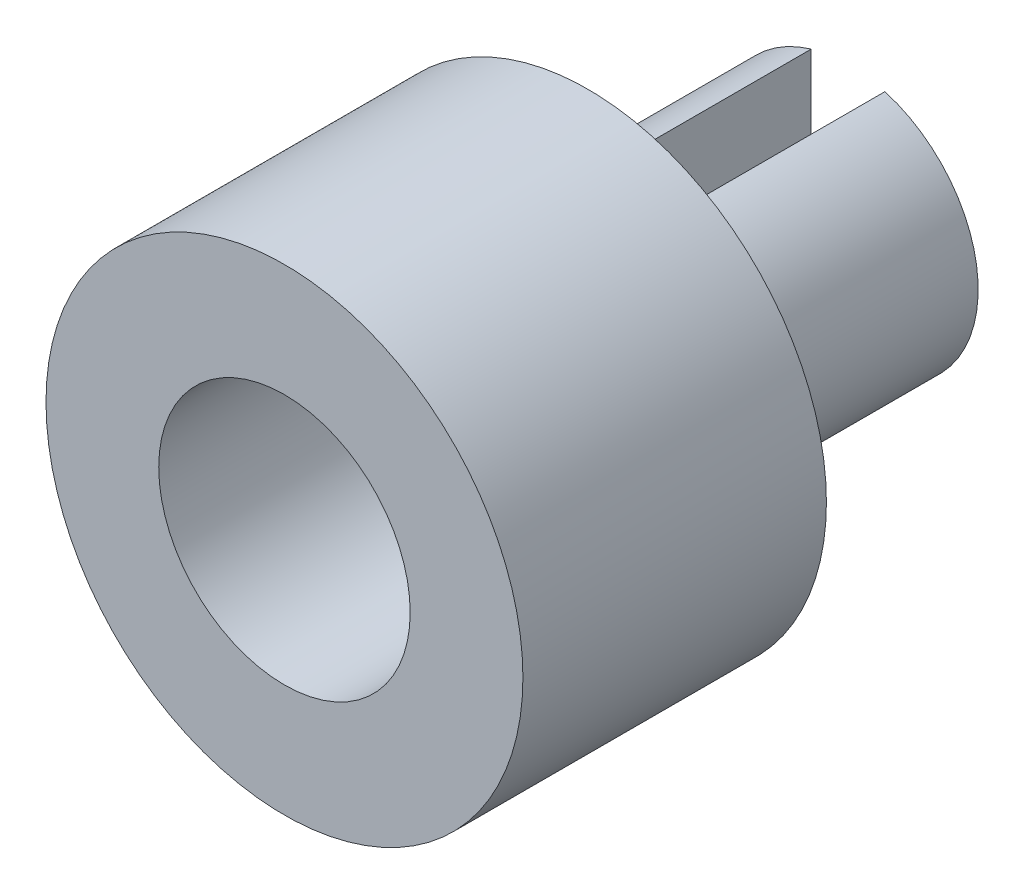
ISO-10303-21;
HEADER;
FILE_DESCRIPTION(('STEP AP214'),'2;1');
FILE_NAME('part.step','',(''),(''),'','','');
FILE_SCHEMA(('AUTOMOTIVE_DESIGN { 1 0 10303 214 1 1 1 1 }'));
ENDSEC;
DATA;
#1=APPLICATION_CONTEXT('core data for automotive mechanical design processes');
#2=APPLICATION_PROTOCOL_DEFINITION('international standard','automotive_design',2000,#1);
#3=PRODUCT_CONTEXT('',#1,'mechanical');
#4=PRODUCT('Part','Part','',(#3));
#5=PRODUCT_RELATED_PRODUCT_CATEGORY('part','',(#4));
#6=PRODUCT_DEFINITION_FORMATION('','',#4);
#7=PRODUCT_DEFINITION_CONTEXT('part definition',#1,'design');
#8=PRODUCT_DEFINITION('design','',#6,#7);
#9=PRODUCT_DEFINITION_SHAPE('','',#8);
#10=(LENGTH_UNIT() NAMED_UNIT(*) SI_UNIT(.MILLI.,.METRE.));
#11=(NAMED_UNIT(*) PLANE_ANGLE_UNIT() SI_UNIT($,.RADIAN.));
#12=(NAMED_UNIT(*) SI_UNIT($,.STERADIAN.) SOLID_ANGLE_UNIT());
#13=UNCERTAINTY_MEASURE_WITH_UNIT(LENGTH_MEASURE(1.E-05),#10,'distance_accuracy_value','');
#14=(GEOMETRIC_REPRESENTATION_CONTEXT(3) GLOBAL_UNCERTAINTY_ASSIGNED_CONTEXT((#13)) GLOBAL_UNIT_ASSIGNED_CONTEXT((#10,
#11,#12)) REPRESENTATION_CONTEXT('',''));
#15=CARTESIAN_POINT('',(0.,0.,0.));
#16=DIRECTION('',(0.,0.,1.));
#17=DIRECTION('',(1.,0.,0.));
#18=AXIS2_PLACEMENT_3D('',#15,#16,#17);
#19=CARTESIAN_POINT('',(10.,0.,2.));
#20=DIRECTION('',(0.,0.,1.));
#21=DIRECTION('',(1.,0.,0.));
#22=AXIS2_PLACEMENT_3D('',#19,#20,#21);
#23=CYLINDRICAL_SURFACE('',#22,5.5);
#24=CARTESIAN_POINT('',(10.,0.,2.));
#25=DIRECTION('',(0.,0.,-1.));
#26=DIRECTION('',(-1.,0.,0.));
#27=AXIS2_PLACEMENT_3D('',#24,#25,#26);
#28=CIRCLE('',#27,5.5);
#29=CARTESIAN_POINT('',(4.5,0.,2.));
#30=VERTEX_POINT('',#29);
#31=EDGE_CURVE('E163',#30,#30,#28,.T.);
#32=ORIENTED_EDGE('',*,*,#31,.F.);
#33=EDGE_LOOP('',(#32));
#34=FACE_BOUND('',#33,.T.);
#35=CARTESIAN_POINT('',(10.,0.,9.));
#36=DIRECTION('',(0.,0.,-1.));
#37=DIRECTION('',(-1.,0.,0.));
#38=AXIS2_PLACEMENT_3D('',#35,#36,#37);
#39=CIRCLE('',#38,5.5);
#40=CARTESIAN_POINT('',(4.5,0.,9.));
#41=VERTEX_POINT('',#40);
#42=EDGE_CURVE('E162',#41,#41,#39,.T.);
#43=ORIENTED_EDGE('',*,*,#42,.T.);
#44=EDGE_LOOP('',(#43));
#45=FACE_BOUND('',#44,.T.);
#46=ADVANCED_FACE('F57',(#34,#45),#23,.T.);
#47=CARTESIAN_POINT('',(10.,0.,2.));
#48=DIRECTION('',(0.,0.,-1.));
#49=DIRECTION('',(-1.,0.,0.));
#50=AXIS2_PLACEMENT_3D('',#47,#48,#49);
#51=PLANE('',#50);
#52=CARTESIAN_POINT('',(10.,0.,2.));
#53=DIRECTION('',(0.,0.,-1.));
#54=DIRECTION('',(-1.,0.,0.));
#55=AXIS2_PLACEMENT_3D('',#52,#53,#54);
#56=CIRCLE('',#55,3.2);
#57=CARTESIAN_POINT('',(10.05,-3.19960935115523,2.));
#58=VERTEX_POINT('',#57);
#59=CARTESIAN_POINT('',(10.05,3.19960935115523,2.));
#60=VERTEX_POINT('',#59);
#61=EDGE_CURVE('E175',#58,#60,#56,.F.);
#62=ORIENTED_EDGE('',*,*,#61,.T.);
#63=DIRECTION('',(0.,1.,0.));
#64=VECTOR('',#63,1.);
#65=CARTESIAN_POINT('',(10.05,0.,2.));
#66=LINE('',#65,#64);
#67=EDGE_CURVE('E185',#60,#58,#66,.F.);
#68=ORIENTED_EDGE('',*,*,#67,.T.);
#69=EDGE_LOOP('',(#62,#68));
#70=FACE_BOUND('',#69,.T.);
#71=CARTESIAN_POINT('',(10.,0.,2.));
#72=DIRECTION('',(0.,0.,-1.));
#73=DIRECTION('',(-1.,0.,0.));
#74=AXIS2_PLACEMENT_3D('',#71,#72,#73);
#75=CIRCLE('',#74,3.2);
#76=CARTESIAN_POINT('',(9.95,3.19960935115523,2.));
#77=VERTEX_POINT('',#76);
#78=CARTESIAN_POINT('',(9.95,-3.19960935115523,2.));
#79=VERTEX_POINT('',#78);
#80=EDGE_CURVE('E172',#77,#79,#75,.F.);
#81=ORIENTED_EDGE('',*,*,#80,.T.);
#82=DIRECTION('',(0.,-1.,0.));
#83=VECTOR('',#82,1.);
#84=CARTESIAN_POINT('',(9.95,0.,2.));
#85=LINE('',#84,#83);
#86=EDGE_CURVE('E189',#79,#77,#85,.F.);
#87=ORIENTED_EDGE('',*,*,#86,.T.);
#88=EDGE_LOOP('',(#81,#87));
#89=FACE_BOUND('',#88,.T.);
#90=ORIENTED_EDGE('',*,*,#31,.T.);
#91=EDGE_LOOP('',(#90));
#92=FACE_BOUND('',#91,.T.);
#93=ADVANCED_FACE('F271',(#70,#89,#92),#51,.T.);
#94=CARTESIAN_POINT('',(10.,0.,9.));
#95=DIRECTION('',(0.,0.,-1.));
#96=DIRECTION('',(-1.,0.,0.));
#97=AXIS2_PLACEMENT_3D('',#94,#95,#96);
#98=PLANE('',#97);
#99=CARTESIAN_POINT('',(10.,0.,9.));
#100=DIRECTION('',(0.,0.,1.));
#101=DIRECTION('',(1.,0.,0.));
#102=AXIS2_PLACEMENT_3D('',#99,#100,#101);
#103=CIRCLE('',#102,2.9);
#104=CARTESIAN_POINT('',(12.9,0.,9.));
#105=VERTEX_POINT('',#104);
#106=EDGE_CURVE('E323',#105,#105,#103,.T.);
#107=ORIENTED_EDGE('',*,*,#106,.F.);
#108=EDGE_LOOP('',(#107));
#109=FACE_BOUND('',#108,.T.);
#110=ORIENTED_EDGE('',*,*,#42,.F.);
#111=EDGE_LOOP('',(#110));
#112=FACE_BOUND('',#111,.T.);
#113=ADVANCED_FACE('F277',(#109,#112),#98,.F.);
#114=CARTESIAN_POINT('',(9.15,0.,-4.));
#115=DIRECTION('',(-1.,0.,0.));
#116=DIRECTION('',(0.,0.,1.));
#117=AXIS2_PLACEMENT_3D('',#114,#115,#116);
#118=PLANE('',#117);
#119=DIRECTION('',(0.,0.,1.));
#120=VECTOR('',#119,1.);
#121=CARTESIAN_POINT('',(9.15,2.87706447616316,-4.));
#122=LINE('',#121,#120);
#123=CARTESIAN_POINT('',(9.15,2.87706447616316,-4.));
#124=VERTEX_POINT('',#123);
#125=CARTESIAN_POINT('',(9.15,2.87706447616316,1.2));
#126=VERTEX_POINT('',#125);
#127=EDGE_CURVE('E154',#124,#126,#122,.T.);
#128=ORIENTED_EDGE('',*,*,#127,.T.);
#129=DIRECTION('',(0.,-1.,0.));
#130=VECTOR('',#129,1.);
#131=CARTESIAN_POINT('',(9.15,0.,1.2));
#132=LINE('',#131,#130);
#133=CARTESIAN_POINT('',(9.15,-2.87706447616316,1.2));
#134=VERTEX_POINT('',#133);
#135=EDGE_CURVE('E181',#126,#134,#132,.T.);
#136=ORIENTED_EDGE('',*,*,#135,.T.);
#137=DIRECTION('',(0.,0.,1.));
#138=VECTOR('',#137,1.);
#139=CARTESIAN_POINT('',(9.15,-2.87706447616316,-4.));
#140=LINE('',#139,#138);
#141=CARTESIAN_POINT('',(9.15,-2.87706447616316,-4.));
#142=VERTEX_POINT('',#141);
#143=EDGE_CURVE('E158',#142,#134,#140,.T.);
#144=ORIENTED_EDGE('',*,*,#143,.F.);
#145=DIRECTION('',(0.,-1.,0.));
#146=VECTOR('',#145,1.);
#147=CARTESIAN_POINT('',(9.15,0.,-4.));
#148=LINE('',#147,#146);
#149=EDGE_CURVE('E146',#124,#142,#148,.T.);
#150=ORIENTED_EDGE('',*,*,#149,.F.);
#151=EDGE_LOOP('',(#128,#136,#144,#150));
#152=FACE_BOUND('',#151,.T.);
#153=ADVANCED_FACE('F269',(#152),#118,.F.);
#154=CARTESIAN_POINT('',(10.,0.,-4.));
#155=DIRECTION('',(0.,0.,1.));
#156=DIRECTION('',(1.,0.,0.));
#157=AXIS2_PLACEMENT_3D('',#154,#155,#156);
#158=CYLINDRICAL_SURFACE('',#157,3.);
#159=ORIENTED_EDGE('',*,*,#143,.T.);
#160=CARTESIAN_POINT('',(9.15,-2.87706447616316,1.2));
#161=CARTESIAN_POINT('',(9.14995658457261,-2.87702294042068,1.24401457858481));
#162=CARTESIAN_POINT('',(9.1536290746142,-2.87813650607465,1.28799891287807));
#163=CARTESIAN_POINT('',(9.1680679009095,-2.88235815882223,1.37460277954558));
#164=CARTESIAN_POINT('',(9.17881993904506,-2.88546222549705,1.41722488158952));
#165=CARTESIAN_POINT('',(9.20708174329589,-2.89335137437877,1.49998521487485));
#166=CARTESIAN_POINT('',(9.22459121849557,-2.89813638421831,1.54012355295887));
#167=CARTESIAN_POINT('',(9.26582480006136,-2.90885562563724,1.61689230002051));
#168=CARTESIAN_POINT('',(9.28954653958198,-2.91478941931102,1.65352403775475));
#169=CARTESIAN_POINT('',(9.3316802306274,-2.92465486296381,1.70827234108567));
#170=CARTESIAN_POINT('',(9.34829380464681,-2.92841239747392,1.72783228721421));
#171=CARTESIAN_POINT('',(9.38328199921848,-2.93598015903384,1.76522988002132));
#172=CARTESIAN_POINT('',(9.40165341614599,-2.93979027979277,1.7830705452375));
#173=CARTESIAN_POINT('',(9.42084973778708,-2.94356670958528,1.8));
#174=B_SPLINE_CURVE_WITH_KNOTS('',3,(#160,#161,#162,#163,#164,#165,#166,#167,#168,#169,#170,
#171,#172,#173),.UNSPECIFIED.,.F.,.F.,(4,2,2,2,2,2,4),(0.,0.131830819997787,0.263396202907975,
0.394955922406245,0.526465590965929,0.604170225827502,0.681735849640497),.UNSPECIFIED.);
#175=CARTESIAN_POINT('',(9.42084973778708,-2.94356670958528,1.8));
#176=VERTEX_POINT('',#175);
#177=EDGE_CURVE('E196',#134,#176,#174,.T.);
#178=ORIENTED_EDGE('',*,*,#177,.T.);
#179=CARTESIAN_POINT('',(10.,0.,1.8));
#180=DIRECTION('',(0.,0.,-1.));
#181=DIRECTION('',(-1.,0.,0.));
#182=AXIS2_PLACEMENT_3D('',#179,#180,#181);
#183=CIRCLE('',#182,3.);
#184=CARTESIAN_POINT('',(9.42084973778708,2.94356670958528,1.8));
#185=VERTEX_POINT('',#184);
#186=EDGE_CURVE('E178',#176,#185,#183,.T.);
#187=ORIENTED_EDGE('',*,*,#186,.T.);
#188=CARTESIAN_POINT('',(9.42084973778708,2.94356670958528,1.8));
#189=CARTESIAN_POINT('',(9.38716589528042,2.93693942544863,1.77033263749932));
#190=CARTESIAN_POINT('',(9.35602623353235,2.93021071354206,1.73779647140253));
#191=CARTESIAN_POINT('',(9.29953026339045,2.91722219970662,1.66786765293636));
#192=CARTESIAN_POINT('',(9.27418360078941,2.91096319134023,1.63046706103298));
#193=CARTESIAN_POINT('',(9.23005322310111,2.89960412420635,1.5517382645471));
#194=CARTESIAN_POINT('',(9.21127899347871,2.89450574415884,1.51040449196748));
#195=CARTESIAN_POINT('',(9.1809818080549,2.88608026899819,1.42506029743404));
#196=CARTESIAN_POINT('',(9.16944272075491,2.88274923597299,1.38105607172221));
#197=CARTESIAN_POINT('',(9.15781644895303,2.87936476540232,1.31388140835428));
#198=CARTESIAN_POINT('',(9.15488792021617,2.87850513526242,1.29120921315739));
#199=CARTESIAN_POINT('',(9.15097998138233,2.87735417811352,1.24569532796752));
#200=CARTESIAN_POINT('',(9.14999954165248,2.87706255089679,1.22285373391912));
#201=CARTESIAN_POINT('',(9.15,2.87706447616316,1.2));
#202=B_SPLINE_CURVE_WITH_KNOTS('',3,(#188,#189,#190,#191,#192,#193,#194,#195,#196,#197,#198,
#199,#200,#201),.UNSPECIFIED.,.F.,.F.,(4,2,2,2,2,2,4),(0.,0.13596976450787,0.272164306056535,
0.4085546036824,0.54463971346313,0.6131904999176,0.681705045246736),.UNSPECIFIED.);
#203=EDGE_CURVE('E234',#185,#126,#202,.T.);
#204=ORIENTED_EDGE('',*,*,#203,.T.);
#205=ORIENTED_EDGE('',*,*,#127,.F.);
#206=CARTESIAN_POINT('',(10.,0.,-4.));
#207=DIRECTION('',(0.,0.,-1.));
#208=DIRECTION('',(-1.,0.,0.));
#209=AXIS2_PLACEMENT_3D('',#206,#207,#208);
#210=CIRCLE('',#209,3.);
#211=EDGE_CURVE('E149',#142,#124,#210,.T.);
#212=ORIENTED_EDGE('',*,*,#211,.F.);
#213=EDGE_LOOP('',(#159,#178,#187,#204,#205,#212));
#214=FACE_BOUND('',#213,.T.);
#215=ADVANCED_FACE('F212',(#214),#158,.T.);
#216=CARTESIAN_POINT('',(10.,0.,-4.));
#217=DIRECTION('',(0.,0.,-1.));
#218=DIRECTION('',(-1.,0.,0.));
#219=AXIS2_PLACEMENT_3D('',#216,#217,#218);
#220=PLANE('',#219);
#221=ORIENTED_EDGE('',*,*,#149,.T.);
#222=ORIENTED_EDGE('',*,*,#211,.T.);
#223=EDGE_LOOP('',(#221,#222));
#224=FACE_BOUND('',#223,.T.);
#225=ADVANCED_FACE('F261',(#224),#220,.T.);
#226=CARTESIAN_POINT('',(10.85,0.,-4.));
#227=DIRECTION('',(1.,0.,0.));
#228=DIRECTION('',(0.,0.,-1.));
#229=AXIS2_PLACEMENT_3D('',#226,#227,#228);
#230=PLANE('',#229);
#231=DIRECTION('',(0.,0.,1.));
#232=VECTOR('',#231,1.);
#233=CARTESIAN_POINT('',(10.85,-2.87706447616316,-4.));
#234=LINE('',#233,#232);
#235=CARTESIAN_POINT('',(10.85,-2.87706447616316,-4.));
#236=VERTEX_POINT('',#235);
#237=CARTESIAN_POINT('',(10.85,-2.87706447616316,1.2));
#238=VERTEX_POINT('',#237);
#239=EDGE_CURVE('E133',#236,#238,#234,.T.);
#240=ORIENTED_EDGE('',*,*,#239,.T.);
#241=DIRECTION('',(0.,1.,0.));
#242=VECTOR('',#241,1.);
#243=CARTESIAN_POINT('',(10.85,0.,1.2));
#244=LINE('',#243,#242);
#245=CARTESIAN_POINT('',(10.85,2.87706447616316,1.2));
#246=VERTEX_POINT('',#245);
#247=EDGE_CURVE('E193',#238,#246,#244,.T.);
#248=ORIENTED_EDGE('',*,*,#247,.T.);
#249=DIRECTION('',(0.,0.,1.));
#250=VECTOR('',#249,1.);
#251=CARTESIAN_POINT('',(10.85,2.87706447616316,-4.));
#252=LINE('',#251,#250);
#253=CARTESIAN_POINT('',(10.85,2.87706447616316,-4.));
#254=VERTEX_POINT('',#253);
#255=EDGE_CURVE('E142',#254,#246,#252,.T.);
#256=ORIENTED_EDGE('',*,*,#255,.F.);
#257=DIRECTION('',(0.,1.,0.));
#258=VECTOR('',#257,1.);
#259=CARTESIAN_POINT('',(10.85,0.,-4.));
#260=LINE('',#259,#258);
#261=EDGE_CURVE('E129',#236,#254,#260,.T.);
#262=ORIENTED_EDGE('',*,*,#261,.F.);
#263=EDGE_LOOP('',(#240,#248,#256,#262));
#264=FACE_BOUND('',#263,.T.);
#265=ADVANCED_FACE('F144',(#264),#230,.F.);
#266=CARTESIAN_POINT('',(10.,0.,-4.));
#267=DIRECTION('',(0.,0.,1.));
#268=DIRECTION('',(1.,0.,0.));
#269=AXIS2_PLACEMENT_3D('',#266,#267,#268);
#270=CYLINDRICAL_SURFACE('',#269,3.);
#271=ORIENTED_EDGE('',*,*,#255,.T.);
#272=CARTESIAN_POINT('',(10.85,2.87706447616316,1.2));
#273=CARTESIAN_POINT('',(10.8500434154274,2.87702294042068,1.24401457858481));
#274=CARTESIAN_POINT('',(10.8463709253858,2.87813650607465,1.28799891287807));
#275=CARTESIAN_POINT('',(10.8319320990905,2.88235815882223,1.37460277954558));
#276=CARTESIAN_POINT('',(10.8211800609549,2.88546222549705,1.41722488158952));
#277=CARTESIAN_POINT('',(10.7929182567041,2.89335137437877,1.49998521487485));
#278=CARTESIAN_POINT('',(10.7754087815044,2.89813638421831,1.54012355295887));
#279=CARTESIAN_POINT('',(10.7341751999386,2.90885562563724,1.61689230002051));
#280=CARTESIAN_POINT('',(10.710453460418,2.91478941931102,1.65352403775475));
#281=CARTESIAN_POINT('',(10.6683197693726,2.92465486296381,1.70827234108567));
#282=CARTESIAN_POINT('',(10.6517061953532,2.92841239747392,1.72783228721421));
#283=CARTESIAN_POINT('',(10.6167180007815,2.93598015903384,1.76522988002132));
#284=CARTESIAN_POINT('',(10.598346583854,2.93979027979277,1.7830705452375));
#285=CARTESIAN_POINT('',(10.5791502622129,2.94356670958528,1.8));
#286=B_SPLINE_CURVE_WITH_KNOTS('',3,(#272,#273,#274,#275,#276,#277,#278,#279,#280,#281,#282,
#283,#284,#285),.UNSPECIFIED.,.F.,.F.,(4,2,2,2,2,2,4),(0.,0.131830819997787,0.263396202907975,
0.394955922406245,0.526465590965929,0.604170225827502,0.681735849640497),.UNSPECIFIED.);
#287=CARTESIAN_POINT('',(10.5791502622129,2.94356670958528,1.8));
#288=VERTEX_POINT('',#287);
#289=EDGE_CURVE('E241',#246,#288,#286,.T.);
#290=ORIENTED_EDGE('',*,*,#289,.T.);
#291=CARTESIAN_POINT('',(10.,0.,1.8));
#292=DIRECTION('',(0.,0.,-1.));
#293=DIRECTION('',(-1.,0.,0.));
#294=AXIS2_PLACEMENT_3D('',#291,#292,#293);
#295=CIRCLE('',#294,3.);
#296=CARTESIAN_POINT('',(10.5791502622129,-2.94356670958528,1.8));
#297=VERTEX_POINT('',#296);
#298=EDGE_CURVE('E78',#288,#297,#295,.T.);
#299=ORIENTED_EDGE('',*,*,#298,.T.);
#300=CARTESIAN_POINT('',(10.5791502622129,-2.94356670958528,1.8));
#301=CARTESIAN_POINT('',(10.6128341047196,-2.93693942544863,1.77033263749932));
#302=CARTESIAN_POINT('',(10.6439737664676,-2.93021071354206,1.73779647140253));
#303=CARTESIAN_POINT('',(10.7004697366095,-2.91722219970662,1.66786765293636));
#304=CARTESIAN_POINT('',(10.7258163992106,-2.91096319134023,1.63046706103298));
#305=CARTESIAN_POINT('',(10.7699467768989,-2.89960412420635,1.5517382645471));
#306=CARTESIAN_POINT('',(10.7887210065213,-2.89450574415884,1.51040449196748));
#307=CARTESIAN_POINT('',(10.8190181919451,-2.88608026899819,1.42506029743404));
#308=CARTESIAN_POINT('',(10.8305572792451,-2.88274923597299,1.38105607172221));
#309=CARTESIAN_POINT('',(10.842183551047,-2.87936476540232,1.31388140835428));
#310=CARTESIAN_POINT('',(10.8451120797838,-2.87850513526242,1.29120921315739));
#311=CARTESIAN_POINT('',(10.8490200186177,-2.87735417811352,1.24569532796752));
#312=CARTESIAN_POINT('',(10.8500004583475,-2.87706255089679,1.22285373391912));
#313=CARTESIAN_POINT('',(10.85,-2.87706447616316,1.2));
#314=B_SPLINE_CURVE_WITH_KNOTS('',3,(#300,#301,#302,#303,#304,#305,#306,#307,#308,#309,#310,
#311,#312,#313),.UNSPECIFIED.,.F.,.F.,(4,2,2,2,2,2,4),(0.,0.13596976450787,0.272164306056535,
0.4085546036824,0.54463971346313,0.613190499917601,0.681705045246736),.UNSPECIFIED.);
#315=EDGE_CURVE('E11',#297,#238,#314,.T.);
#316=ORIENTED_EDGE('',*,*,#315,.T.);
#317=ORIENTED_EDGE('',*,*,#239,.F.);
#318=CARTESIAN_POINT('',(10.,0.,-4.));
#319=DIRECTION('',(0.,0.,-1.));
#320=DIRECTION('',(-1.,0.,0.));
#321=AXIS2_PLACEMENT_3D('',#318,#319,#320);
#322=CIRCLE('',#321,3.);
#323=EDGE_CURVE('E125',#254,#236,#322,.T.);
#324=ORIENTED_EDGE('',*,*,#323,.F.);
#325=EDGE_LOOP('',(#271,#290,#299,#316,#317,#324));
#326=FACE_BOUND('',#325,.T.);
#327=ADVANCED_FACE('F136',(#326),#270,.T.);
#328=CARTESIAN_POINT('',(10.,0.,-4.));
#329=DIRECTION('',(0.,0.,-1.));
#330=DIRECTION('',(-1.,0.,0.));
#331=AXIS2_PLACEMENT_3D('',#328,#329,#330);
#332=PLANE('',#331);
#333=ORIENTED_EDGE('',*,*,#261,.T.);
#334=ORIENTED_EDGE('',*,*,#323,.T.);
#335=EDGE_LOOP('',(#333,#334));
#336=FACE_BOUND('',#335,.T.);
#337=ADVANCED_FACE('F127',(#336),#332,.T.);
#338=CARTESIAN_POINT('',(10.,0.,1.8));
#339=DIRECTION('',(0.,0.,-1.));
#340=DIRECTION('',(-1.,0.,0.));
#341=AXIS2_PLACEMENT_3D('',#338,#339,#340);
#342=TOROIDAL_SURFACE('',#341,3.2,0.2);
#343=ORIENTED_EDGE('',*,*,#298,.F.);
#344=CARTESIAN_POINT('',(10.5791502622129,2.94356670958528,1.8));
#345=CARTESIAN_POINT('',(10.5687189070264,2.94562898839064,1.80919998078134));
#346=CARTESIAN_POINT('',(10.5581309939119,2.9482901722639,1.81805372913114));
#347=CARTESIAN_POINT('',(10.5367150502261,2.95457530277074,1.83505494561792));
#348=CARTESIAN_POINT('',(10.5258876182375,2.95819705374683,1.84320396897859));
#349=CARTESIAN_POINT('',(10.4932194457103,2.97012121962354,1.86653595717657));
#350=CARTESIAN_POINT('',(10.4710617818424,2.97951395008798,1.88071812276644));
#351=CARTESIAN_POINT('',(10.4290704419721,2.9987452229345,1.90485021105493));
#352=CARTESIAN_POINT('',(10.4093093443798,3.0083668774647,1.91511068347957));
#353=CARTESIAN_POINT('',(10.3693817637482,3.02850997319864,1.93381249582661));
#354=CARTESIAN_POINT('',(10.3492151021641,3.03903181764049,1.94225301448201));
#355=CARTESIAN_POINT('',(10.2880483865577,3.07149486974101,1.96500583432357));
#356=CARTESIAN_POINT('',(10.2465019402674,3.09427418085654,1.97668156948013));
#357=CARTESIAN_POINT('',(10.1579710448536,3.1425086016771,1.99408715703565));
#358=CARTESIAN_POINT('',(10.1108617672065,3.16800120799707,1.9990957043718));
#359=CARTESIAN_POINT('',(10.0605804662989,3.19413682936302,1.99993482244215));
#360=CARTESIAN_POINT('',(10.0578043012142,3.19557641562321,1.99996674729064));
#361=CARTESIAN_POINT('',(10.053351631968,3.19787961513698,1.99999473714039));
#362=CARTESIAN_POINT('',(10.0516761232693,3.1987449916365,2.00000000697409));
#363=CARTESIAN_POINT('',(10.05,3.19960935115523,2.));
#364=B_SPLINE_CURVE_WITH_KNOTS('',3,(#344,#345,#346,#347,#348,#349,#350,#351,#352,#353,#354,
#355,#356,#357,#358,#359,#360,#361,#362,#363),.UNSPECIFIED.,.F.,.F.,(4,2,2,2,2,2,2,2,2,4),(0.,
0.0421303257106732,0.0841651680028063,0.167710555514946,0.240389398126177,0.313100969256899,
0.458970003599474,0.619601078783137,0.628983390456745,0.634640820380132),.UNSPECIFIED.);
#365=EDGE_CURVE('E248',#288,#60,#364,.T.);
#366=ORIENTED_EDGE('',*,*,#365,.T.);
#367=ORIENTED_EDGE('',*,*,#61,.F.);
#368=CARTESIAN_POINT('',(10.5791502622129,-2.94356670958528,1.8));
#369=CARTESIAN_POINT('',(10.5687189070264,-2.94562898839064,1.80919998078134));
#370=CARTESIAN_POINT('',(10.5581309939119,-2.9482901722639,1.81805372913114));
#371=CARTESIAN_POINT('',(10.5367150502261,-2.95457530277074,1.83505494561792));
#372=CARTESIAN_POINT('',(10.5258876182375,-2.95819705374683,1.84320396897859));
#373=CARTESIAN_POINT('',(10.4932194457103,-2.97012121962354,1.86653595717657));
#374=CARTESIAN_POINT('',(10.4710617818424,-2.97951395008798,1.88071812276644));
#375=CARTESIAN_POINT('',(10.4290704419721,-2.9987452229345,1.90485021105493));
#376=CARTESIAN_POINT('',(10.4093093443798,-3.0083668774647,1.91511068347957));
#377=CARTESIAN_POINT('',(10.3693817637482,-3.02850997319864,1.93381249582661));
#378=CARTESIAN_POINT('',(10.3492151021641,-3.03903181764049,1.94225301448201));
#379=CARTESIAN_POINT('',(10.2880483865577,-3.07149486974101,1.96500583432357));
#380=CARTESIAN_POINT('',(10.2465019402674,-3.09427418085654,1.97668156948013));
#381=CARTESIAN_POINT('',(10.1579710448536,-3.1425086016771,1.99408715703565));
#382=CARTESIAN_POINT('',(10.1108617672065,-3.16800120799707,1.9990957043718));
#383=CARTESIAN_POINT('',(10.0605804662989,-3.19413682936302,1.99993482244215));
#384=CARTESIAN_POINT('',(10.0578043012142,-3.19557641562321,1.99996674729064));
#385=CARTESIAN_POINT('',(10.053351631968,-3.19787961513698,1.99999473714039));
#386=CARTESIAN_POINT('',(10.0516761232693,-3.1987449916365,2.00000000697409));
#387=CARTESIAN_POINT('',(10.05,-3.19960935115523,2.));
#388=B_SPLINE_CURVE_WITH_KNOTS('',3,(#368,#369,#370,#371,#372,#373,#374,#375,#376,#377,#378,
#379,#380,#381,#382,#383,#384,#385,#386,#387),.UNSPECIFIED.,.F.,.F.,(4,2,2,2,2,2,2,2,2,4),(0.,
0.0421303257106732,0.0841651680028063,0.167710555514946,0.240389398126177,0.313100969256899,
0.458970003599474,0.619601078783137,0.628983390456745,0.634640820380132),.UNSPECIFIED.);
#389=EDGE_CURVE('E72',#58,#297,#388,.F.);
#390=ORIENTED_EDGE('',*,*,#389,.T.);
#391=EDGE_LOOP('',(#343,#366,#367,#390));
#392=FACE_BOUND('',#391,.T.);
#393=ADVANCED_FACE('F260',(#392),#342,.F.);
#394=CARTESIAN_POINT('',(10.,0.,1.8));
#395=DIRECTION('',(0.,0.,-1.));
#396=DIRECTION('',(-1.,0.,0.));
#397=AXIS2_PLACEMENT_3D('',#394,#395,#396);
#398=TOROIDAL_SURFACE('',#397,3.2,0.2);
#399=ORIENTED_EDGE('',*,*,#186,.F.);
#400=CARTESIAN_POINT('',(9.42084973778708,-2.94356670958528,1.8));
#401=CARTESIAN_POINT('',(9.43128109297358,-2.94562898839064,1.80919998078134));
#402=CARTESIAN_POINT('',(9.44186900608814,-2.9482901722639,1.81805372913114));
#403=CARTESIAN_POINT('',(9.46328494977391,-2.95457530277074,1.83505494561792));
#404=CARTESIAN_POINT('',(9.47411238176251,-2.95819705374683,1.84320396897859));
#405=CARTESIAN_POINT('',(9.50678055428975,-2.97012121962354,1.86653595717657));
#406=CARTESIAN_POINT('',(9.5289382181576,-2.97951395008798,1.88071812276644));
#407=CARTESIAN_POINT('',(9.5709295580279,-2.9987452229345,1.90485021105493));
#408=CARTESIAN_POINT('',(9.59069065562016,-3.0083668774647,1.91511068347957));
#409=CARTESIAN_POINT('',(9.63061823625183,-3.02850997319864,1.93381249582661));
#410=CARTESIAN_POINT('',(9.65078489783594,-3.03903181764049,1.94225301448201));
#411=CARTESIAN_POINT('',(9.71195161344227,-3.07149486974101,1.96500583432357));
#412=CARTESIAN_POINT('',(9.75349805973264,-3.09427418085654,1.97668156948013));
#413=CARTESIAN_POINT('',(9.84202895514641,-3.1425086016771,1.99408715703565));
#414=CARTESIAN_POINT('',(9.88913823279355,-3.16800120799707,1.9990957043718));
#415=CARTESIAN_POINT('',(9.93941953370107,-3.19413682936302,1.99993482244215));
#416=CARTESIAN_POINT('',(9.94219569878576,-3.19557641562321,1.99996674729064));
#417=CARTESIAN_POINT('',(9.94664836803203,-3.19787961513698,1.99999473714039));
#418=CARTESIAN_POINT('',(9.94832387673075,-3.1987449916365,2.00000000697409));
#419=CARTESIAN_POINT('',(9.95,-3.19960935115523,2.));
#420=B_SPLINE_CURVE_WITH_KNOTS('',3,(#400,#401,#402,#403,#404,#405,#406,#407,#408,#409,#410,
#411,#412,#413,#414,#415,#416,#417,#418,#419),.UNSPECIFIED.,.F.,.F.,(4,2,2,2,2,2,2,2,2,4),(0.,
0.0421303257106732,0.0841651680028063,0.167710555514946,0.240389398126177,0.313100969256899,
0.458970003599474,0.619601078783137,0.628983390456745,0.634640820380132),.UNSPECIFIED.);
#421=EDGE_CURVE('E205',#176,#79,#420,.T.);
#422=ORIENTED_EDGE('',*,*,#421,.T.);
#423=ORIENTED_EDGE('',*,*,#80,.F.);
#424=CARTESIAN_POINT('',(9.42084973778708,2.94356670958528,1.8));
#425=CARTESIAN_POINT('',(9.43128109297358,2.94562898839064,1.80919998078134));
#426=CARTESIAN_POINT('',(9.44186900608814,2.9482901722639,1.81805372913114));
#427=CARTESIAN_POINT('',(9.46328494977391,2.95457530277074,1.83505494561792));
#428=CARTESIAN_POINT('',(9.47411238176251,2.95819705374683,1.84320396897859));
#429=CARTESIAN_POINT('',(9.50678055428975,2.97012121962354,1.86653595717657));
#430=CARTESIAN_POINT('',(9.5289382181576,2.97951395008798,1.88071812276644));
#431=CARTESIAN_POINT('',(9.5709295580279,2.9987452229345,1.90485021105493));
#432=CARTESIAN_POINT('',(9.59069065562016,3.0083668774647,1.91511068347957));
#433=CARTESIAN_POINT('',(9.63061823625183,3.02850997319864,1.93381249582661));
#434=CARTESIAN_POINT('',(9.65078489783594,3.03903181764049,1.94225301448201));
#435=CARTESIAN_POINT('',(9.71195161344227,3.07149486974101,1.96500583432357));
#436=CARTESIAN_POINT('',(9.75349805973264,3.09427418085654,1.97668156948013));
#437=CARTESIAN_POINT('',(9.84202895514641,3.1425086016771,1.99408715703565));
#438=CARTESIAN_POINT('',(9.88913823279355,3.16800120799707,1.9990957043718));
#439=CARTESIAN_POINT('',(9.93941953370107,3.19413682936302,1.99993482244215));
#440=CARTESIAN_POINT('',(9.94219569878576,3.19557641562321,1.99996674729064));
#441=CARTESIAN_POINT('',(9.94664836803203,3.19787961513698,1.99999473714039));
#442=CARTESIAN_POINT('',(9.94832387673075,3.1987449916365,2.00000000697409));
#443=CARTESIAN_POINT('',(9.95,3.19960935115523,2.));
#444=B_SPLINE_CURVE_WITH_KNOTS('',3,(#424,#425,#426,#427,#428,#429,#430,#431,#432,#433,#434,
#435,#436,#437,#438,#439,#440,#441,#442,#443),.UNSPECIFIED.,.F.,.F.,(4,2,2,2,2,2,2,2,2,4),(0.,
0.0421303257106732,0.0841651680028063,0.167710555514946,0.240389398126177,0.313100969256899,
0.458970003599474,0.619601078783137,0.628983390456745,0.634640820380132),.UNSPECIFIED.);
#445=EDGE_CURVE('E227',#77,#185,#444,.F.);
#446=ORIENTED_EDGE('',*,*,#445,.T.);
#447=EDGE_LOOP('',(#399,#422,#423,#446));
#448=FACE_BOUND('',#447,.T.);
#449=ADVANCED_FACE('F219',(#448),#398,.F.);
#450=CARTESIAN_POINT('',(9.95,0.,1.2));
#451=DIRECTION('',(0.,-1.,0.));
#452=DIRECTION('',(0.,0.,-1.));
#453=AXIS2_PLACEMENT_3D('',#450,#451,#452);
#454=CYLINDRICAL_SURFACE('',#453,0.8);
#455=ORIENTED_EDGE('',*,*,#445,.F.);
#456=ORIENTED_EDGE('',*,*,#86,.F.);
#457=ORIENTED_EDGE('',*,*,#421,.F.);
#458=ORIENTED_EDGE('',*,*,#177,.F.);
#459=ORIENTED_EDGE('',*,*,#135,.F.);
#460=ORIENTED_EDGE('',*,*,#203,.F.);
#461=EDGE_LOOP('',(#455,#456,#457,#458,#459,#460));
#462=FACE_BOUND('',#461,.T.);
#463=ADVANCED_FACE('F216',(#462),#454,.F.);
#464=CARTESIAN_POINT('',(10.05,0.,1.2));
#465=DIRECTION('',(0.,1.,0.));
#466=DIRECTION('',(0.,0.,1.));
#467=AXIS2_PLACEMENT_3D('',#464,#465,#466);
#468=CYLINDRICAL_SURFACE('',#467,0.8);
#469=ORIENTED_EDGE('',*,*,#389,.F.);
#470=ORIENTED_EDGE('',*,*,#67,.F.);
#471=ORIENTED_EDGE('',*,*,#365,.F.);
#472=ORIENTED_EDGE('',*,*,#289,.F.);
#473=ORIENTED_EDGE('',*,*,#247,.F.);
#474=ORIENTED_EDGE('',*,*,#315,.F.);
#475=EDGE_LOOP('',(#469,#470,#471,#472,#473,#474));
#476=FACE_BOUND('',#475,.T.);
#477=ADVANCED_FACE('F59',(#476),#468,.F.);
#478=CARTESIAN_POINT('',(10.,0.,4.));
#479=DIRECTION('',(0.,0.,1.));
#480=DIRECTION('',(1.,0.,0.));
#481=AXIS2_PLACEMENT_3D('',#478,#479,#480);
#482=CYLINDRICAL_SURFACE('',#481,2.9);
#483=CARTESIAN_POINT('',(10.,0.,4.));
#484=DIRECTION('',(0.,0.,1.));
#485=DIRECTION('',(1.,0.,0.));
#486=AXIS2_PLACEMENT_3D('',#483,#484,#485);
#487=CIRCLE('',#486,2.9);
#488=CARTESIAN_POINT('',(12.9,0.,4.));
#489=VERTEX_POINT('',#488);
#490=EDGE_CURVE('E327',#489,#489,#487,.T.);
#491=ORIENTED_EDGE('',*,*,#490,.F.);
#492=EDGE_LOOP('',(#491));
#493=FACE_BOUND('',#492,.T.);
#494=ORIENTED_EDGE('',*,*,#106,.T.);
#495=EDGE_LOOP('',(#494));
#496=FACE_BOUND('',#495,.T.);
#497=ADVANCED_FACE('F338',(#493,#496),#482,.F.);
#498=CARTESIAN_POINT('',(10.,0.,4.));
#499=DIRECTION('',(0.,0.,1.));
#500=DIRECTION('',(1.,0.,0.));
#501=AXIS2_PLACEMENT_3D('',#498,#499,#500);
#502=PLANE('',#501);
#503=ORIENTED_EDGE('',*,*,#490,.T.);
#504=EDGE_LOOP('',(#503));
#505=FACE_BOUND('',#504,.T.);
#506=ADVANCED_FACE('F336',(#505),#502,.T.);
#507=CLOSED_SHELL('',(#46,#93,#113,#153,#215,#225,#265,#327,#337,#393,#449,#463,#477,#497,#506));
#508=MANIFOLD_SOLID_BREP('B2',#507);
#509=ADVANCED_BREP_SHAPE_REPRESENTATION('',(#18,#508),#14);
#510=SHAPE_DEFINITION_REPRESENTATION(#9,#509);
ENDSEC;
END-ISO-10303-21;
